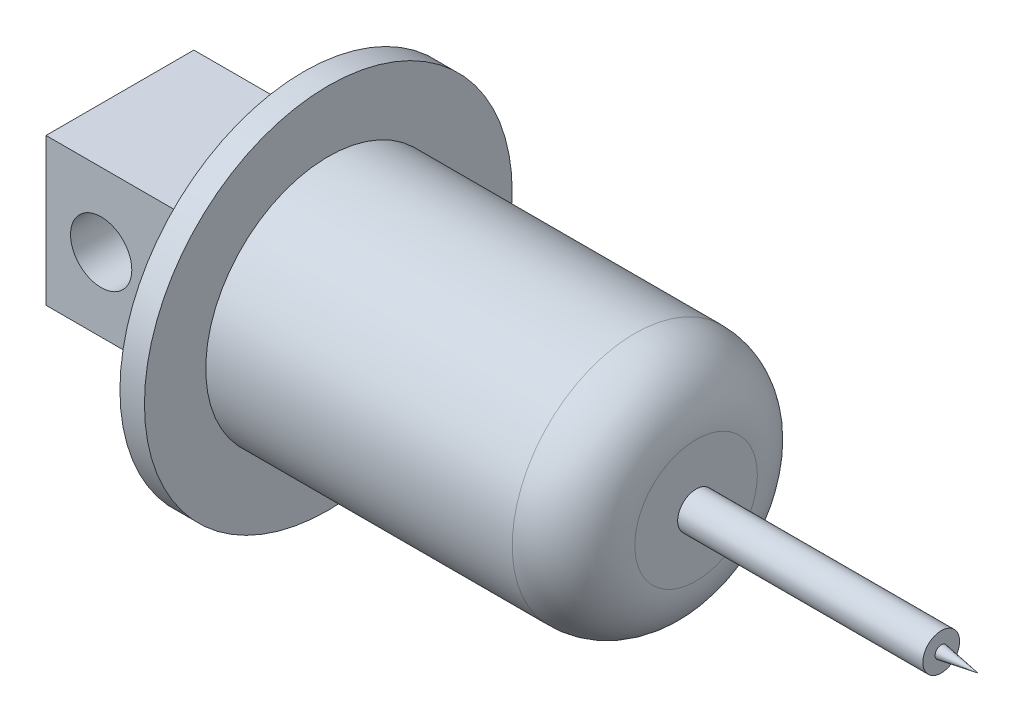
ISO-10303-21;
HEADER;
FILE_DESCRIPTION(('STEP AP214'),'2;1');
FILE_NAME('part.step','',(''),(''),'','','');
FILE_SCHEMA(('AUTOMOTIVE_DESIGN { 1 0 10303 214 1 1 1 1 }'));
ENDSEC;
DATA;
#1=APPLICATION_CONTEXT('core data for automotive mechanical design processes');
#2=APPLICATION_PROTOCOL_DEFINITION('international standard','automotive_design',2000,#1);
#3=PRODUCT_CONTEXT('',#1,'mechanical');
#4=PRODUCT('Part','Part','',(#3));
#5=PRODUCT_RELATED_PRODUCT_CATEGORY('part','',(#4));
#6=PRODUCT_DEFINITION_FORMATION('','',#4);
#7=PRODUCT_DEFINITION_CONTEXT('part definition',#1,'design');
#8=PRODUCT_DEFINITION('design','',#6,#7);
#9=PRODUCT_DEFINITION_SHAPE('','',#8);
#10=(LENGTH_UNIT() NAMED_UNIT(*) SI_UNIT(.MILLI.,.METRE.));
#11=(NAMED_UNIT(*) PLANE_ANGLE_UNIT() SI_UNIT($,.RADIAN.));
#12=(NAMED_UNIT(*) SI_UNIT($,.STERADIAN.) SOLID_ANGLE_UNIT());
#13=UNCERTAINTY_MEASURE_WITH_UNIT(LENGTH_MEASURE(1.E-05),#10,'distance_accuracy_value','');
#14=(GEOMETRIC_REPRESENTATION_CONTEXT(3) GLOBAL_UNCERTAINTY_ASSIGNED_CONTEXT((#13)) GLOBAL_UNIT_ASSIGNED_CONTEXT((#10,
#11,#12)) REPRESENTATION_CONTEXT('',''));
#15=CARTESIAN_POINT('',(0.,0.,0.));
#16=DIRECTION('',(0.,0.,1.));
#17=DIRECTION('',(1.,0.,0.));
#18=AXIS2_PLACEMENT_3D('',#15,#16,#17);
#19=CARTESIAN_POINT('',(-20.,0.,0.));
#20=DIRECTION('',(-1.,0.,0.));
#21=DIRECTION('',(0.,0.,1.));
#22=AXIS2_PLACEMENT_3D('',#19,#20,#21);
#23=CYLINDRICAL_SURFACE('',#22,10.);
#24=CARTESIAN_POINT('',(-25.,0.,0.));
#25=DIRECTION('',(1.,0.,0.));
#26=DIRECTION('',(0.,0.,-1.));
#27=AXIS2_PLACEMENT_3D('',#24,#25,#26);
#28=CIRCLE('',#27,10.);
#29=CARTESIAN_POINT('',(-25.,0.,-9.99999999999991));
#30=VERTEX_POINT('',#29);
#31=EDGE_CURVE('E11',#30,#30,#28,.F.);
#32=ORIENTED_EDGE('',*,*,#31,.T.);
#33=EDGE_LOOP('',(#32));
#34=FACE_BOUND('',#33,.T.);
#35=CARTESIAN_POINT('',(-50.,0.,1.74894432217042E-13));
#36=DIRECTION('',(1.,0.,0.));
#37=DIRECTION('',(0.,0.,-1.));
#38=AXIS2_PLACEMENT_3D('',#35,#36,#37);
#39=CIRCLE('',#38,10.);
#40=CARTESIAN_POINT('',(-50.,0.,-9.99999999999982));
#41=VERTEX_POINT('',#40);
#42=EDGE_CURVE('E167',#41,#41,#39,.T.);
#43=ORIENTED_EDGE('',*,*,#42,.T.);
#44=EDGE_LOOP('',(#43));
#45=FACE_BOUND('',#44,.T.);
#46=ADVANCED_FACE('F34',(#34,#45),#23,.T.);
#47=CARTESIAN_POINT('',(-20.,0.,0.));
#48=DIRECTION('',(1.,0.,0.));
#49=DIRECTION('',(0.,0.,-1.));
#50=AXIS2_PLACEMENT_3D('',#47,#48,#49);
#51=PLANE('',#50);
#52=CARTESIAN_POINT('',(-20.,0.,0.));
#53=DIRECTION('',(1.,0.,0.));
#54=DIRECTION('',(0.,0.,-1.));
#55=AXIS2_PLACEMENT_3D('',#52,#53,#54);
#56=CIRCLE('',#55,1.5);
#57=CARTESIAN_POINT('',(-20.,0.,-1.49999999999993));
#58=VERTEX_POINT('',#57);
#59=EDGE_CURVE('E150',#58,#58,#56,.T.);
#60=ORIENTED_EDGE('',*,*,#59,.F.);
#61=EDGE_LOOP('',(#60));
#62=FACE_BOUND('',#61,.T.);
#63=CARTESIAN_POINT('',(-20.,0.,0.));
#64=DIRECTION('',(1.,0.,0.));
#65=DIRECTION('',(0.,0.,-1.));
#66=AXIS2_PLACEMENT_3D('',#63,#64,#65);
#67=CIRCLE('',#66,5.);
#68=CARTESIAN_POINT('',(-20.,0.,-4.99999999999993));
#69=VERTEX_POINT('',#68);
#70=EDGE_CURVE('E42',#69,#69,#67,.T.);
#71=ORIENTED_EDGE('',*,*,#70,.T.);
#72=EDGE_LOOP('',(#71));
#73=FACE_BOUND('',#72,.T.);
#74=ADVANCED_FACE('F87',(#62,#73),#51,.T.);
#75=CARTESIAN_POINT('',(-52.,0.,1.81877394894729E-13));
#76=DIRECTION('',(1.,0.,0.));
#77=DIRECTION('',(0.,0.,-1.));
#78=AXIS2_PLACEMENT_3D('',#75,#76,#77);
#79=CYLINDRICAL_SURFACE('',#78,15.);
#80=CARTESIAN_POINT('',(-52.,0.,1.81877394894729E-13));
#81=DIRECTION('',(-1.,0.,0.));
#82=DIRECTION('',(0.,0.,1.));
#83=AXIS2_PLACEMENT_3D('',#80,#81,#82);
#84=CIRCLE('',#83,15.);
#85=CARTESIAN_POINT('',(-52.,0.,15.0000000000002));
#86=VERTEX_POINT('',#85);
#87=EDGE_CURVE('E164',#86,#86,#84,.T.);
#88=ORIENTED_EDGE('',*,*,#87,.F.);
#89=EDGE_LOOP('',(#88));
#90=FACE_BOUND('',#89,.T.);
#91=CARTESIAN_POINT('',(-50.,0.,1.74894432217042E-13));
#92=DIRECTION('',(-1.,0.,0.));
#93=DIRECTION('',(0.,0.,1.));
#94=AXIS2_PLACEMENT_3D('',#91,#92,#93);
#95=CIRCLE('',#94,15.);
#96=CARTESIAN_POINT('',(-50.,0.,15.0000000000002));
#97=VERTEX_POINT('',#96);
#98=EDGE_CURVE('E162',#97,#97,#95,.T.);
#99=ORIENTED_EDGE('',*,*,#98,.T.);
#100=EDGE_LOOP('',(#99));
#101=FACE_BOUND('',#100,.T.);
#102=ADVANCED_FACE('F92',(#90,#101),#79,.T.);
#103=CARTESIAN_POINT('',(-52.,0.,1.81877394894729E-13));
#104=DIRECTION('',(-1.,0.,0.));
#105=DIRECTION('',(0.,0.,1.));
#106=AXIS2_PLACEMENT_3D('',#103,#104,#105);
#107=PLANE('',#106);
#108=DIRECTION('',(0.,-1.,0.));
#109=VECTOR('',#108,1.);
#110=CARTESIAN_POINT('',(-52.,-6.,-6.03128939533191));
#111=LINE('',#110,#109);
#112=CARTESIAN_POINT('',(-52.,6.,-6.03128939533191));
#113=VERTEX_POINT('',#112);
#114=CARTESIAN_POINT('',(-52.,-6.,-6.03128939533191));
#115=VERTEX_POINT('',#114);
#116=EDGE_CURVE('E49',#113,#115,#111,.T.);
#117=ORIENTED_EDGE('',*,*,#116,.F.);
#118=DIRECTION('',(0.,0.,-1.));
#119=VECTOR('',#118,1.);
#120=CARTESIAN_POINT('',(-52.,6.,6.03128939533228));
#121=LINE('',#120,#119);
#122=CARTESIAN_POINT('',(-52.,6.,6.03128939533228));
#123=VERTEX_POINT('',#122);
#124=EDGE_CURVE('E53',#123,#113,#121,.T.);
#125=ORIENTED_EDGE('',*,*,#124,.F.);
#126=DIRECTION('',(0.,1.,0.));
#127=VECTOR('',#126,1.);
#128=CARTESIAN_POINT('',(-52.,-6.,6.03128939533228));
#129=LINE('',#128,#127);
#130=CARTESIAN_POINT('',(-52.,-6.,6.03128939533228));
#131=VERTEX_POINT('',#130);
#132=EDGE_CURVE('E277',#131,#123,#129,.T.);
#133=ORIENTED_EDGE('',*,*,#132,.F.);
#134=DIRECTION('',(0.,0.,1.));
#135=VECTOR('',#134,1.);
#136=CARTESIAN_POINT('',(-52.,-6.,6.03128939533228));
#137=LINE('',#136,#135);
#138=EDGE_CURVE('E279',#115,#131,#137,.T.);
#139=ORIENTED_EDGE('',*,*,#138,.F.);
#140=EDGE_LOOP('',(#117,#125,#133,#139));
#141=FACE_BOUND('',#140,.T.);
#142=ORIENTED_EDGE('',*,*,#87,.T.);
#143=EDGE_LOOP('',(#142));
#144=FACE_BOUND('',#143,.T.);
#145=ADVANCED_FACE('F99',(#141,#144),#107,.T.);
#146=CARTESIAN_POINT('',(-50.,0.,1.74894432217042E-13));
#147=DIRECTION('',(-1.,0.,0.));
#148=DIRECTION('',(0.,0.,1.));
#149=AXIS2_PLACEMENT_3D('',#146,#147,#148);
#150=PLANE('',#149);
#151=ORIENTED_EDGE('',*,*,#42,.F.);
#152=EDGE_LOOP('',(#151));
#153=FACE_BOUND('',#152,.T.);
#154=ORIENTED_EDGE('',*,*,#98,.F.);
#155=EDGE_LOOP('',(#154));
#156=FACE_BOUND('',#155,.T.);
#157=ADVANCED_FACE('F101',(#153,#156),#150,.F.);
#158=CARTESIAN_POINT('',(-25.,0.,0.));
#159=DIRECTION('',(1.,0.,0.));
#160=DIRECTION('',(0.,0.,-1.));
#161=AXIS2_PLACEMENT_3D('',#158,#159,#160);
#162=DEGENERATE_TOROIDAL_SURFACE('',#161,5.,5.,.T.);
#163=ORIENTED_EDGE('',*,*,#31,.F.);
#164=EDGE_LOOP('',(#163));
#165=FACE_BOUND('',#164,.T.);
#166=ORIENTED_EDGE('',*,*,#70,.F.);
#167=EDGE_LOOP('',(#166));
#168=FACE_BOUND('',#167,.T.);
#169=ADVANCED_FACE('F36',(#165,#168),#162,.T.);
#170=CARTESIAN_POINT('',(0.,0.,0.));
#171=DIRECTION('',(-1.,0.,0.));
#172=DIRECTION('',(0.,0.,1.));
#173=AXIS2_PLACEMENT_3D('',#170,#171,#172);
#174=CYLINDRICAL_SURFACE('',#173,1.5);
#175=CARTESIAN_POINT('',(0.,0.,0.));
#176=DIRECTION('',(1.,0.,0.));
#177=DIRECTION('',(0.,0.,-1.));
#178=AXIS2_PLACEMENT_3D('',#175,#176,#177);
#179=CIRCLE('',#178,1.5);
#180=CARTESIAN_POINT('',(0.,0.,-1.5));
#181=VERTEX_POINT('',#180);
#182=EDGE_CURVE('E154',#181,#181,#179,.T.);
#183=ORIENTED_EDGE('',*,*,#182,.F.);
#184=EDGE_LOOP('',(#183));
#185=FACE_BOUND('',#184,.T.);
#186=ORIENTED_EDGE('',*,*,#59,.T.);
#187=EDGE_LOOP('',(#186));
#188=FACE_BOUND('',#187,.T.);
#189=ADVANCED_FACE('F107',(#185,#188),#174,.T.);
#190=CARTESIAN_POINT('',(0.,0.,0.));
#191=DIRECTION('',(1.,0.,0.));
#192=DIRECTION('',(0.,0.,-1.));
#193=AXIS2_PLACEMENT_3D('',#190,#191,#192);
#194=PLANE('',#193);
#195=CARTESIAN_POINT('',(0.,0.,0.));
#196=DIRECTION('',(-1.,0.,0.));
#197=DIRECTION('',(0.,0.,1.));
#198=AXIS2_PLACEMENT_3D('',#195,#196,#197);
#199=CIRCLE('',#198,0.5);
#200=CARTESIAN_POINT('',(0.,0.,0.5));
#201=VERTEX_POINT('',#200);
#202=EDGE_CURVE('E292',#201,#201,#199,.T.);
#203=ORIENTED_EDGE('',*,*,#202,.T.);
#204=EDGE_LOOP('',(#203));
#205=FACE_BOUND('',#204,.T.);
#206=ORIENTED_EDGE('',*,*,#182,.T.);
#207=EDGE_LOOP('',(#206));
#208=FACE_BOUND('',#207,.T.);
#209=ADVANCED_FACE('F110',(#205,#208),#194,.T.);
#210=CARTESIAN_POINT('',(-67.,-6.,-6.03128939533186));
#211=DIRECTION('',(0.,0.,1.));
#212=DIRECTION('',(1.,0.,0.));
#213=AXIS2_PLACEMENT_3D('',#210,#211,#212);
#214=PLANE('',#213);
#215=CARTESIAN_POINT('',(-62.5,0.,-6.03128939533188));
#216=DIRECTION('',(0.,0.,1.));
#217=DIRECTION('',(1.,0.,0.));
#218=AXIS2_PLACEMENT_3D('',#215,#216,#217);
#219=CIRCLE('',#218,2.5);
#220=CARTESIAN_POINT('',(-60.,0.,-6.03128939533189));
#221=VERTEX_POINT('',#220);
#222=EDGE_CURVE('E282',#221,#221,#219,.T.);
#223=ORIENTED_EDGE('',*,*,#222,.T.);
#224=EDGE_LOOP('',(#223));
#225=FACE_BOUND('',#224,.T.);
#226=ORIENTED_EDGE('',*,*,#116,.T.);
#227=DIRECTION('',(1.,0.,0.));
#228=VECTOR('',#227,1.);
#229=CARTESIAN_POINT('',(-67.,-6.,-6.03128939533186));
#230=LINE('',#229,#228);
#231=CARTESIAN_POINT('',(-67.,-6.,-6.03128939533186));
#232=VERTEX_POINT('',#231);
#233=EDGE_CURVE('E148',#232,#115,#230,.T.);
#234=ORIENTED_EDGE('',*,*,#233,.F.);
#235=DIRECTION('',(0.,-1.,0.));
#236=VECTOR('',#235,1.);
#237=CARTESIAN_POINT('',(-67.,-6.,-6.03128939533186));
#238=LINE('',#237,#236);
#239=CARTESIAN_POINT('',(-67.,6.,-6.03128939533186));
#240=VERTEX_POINT('',#239);
#241=EDGE_CURVE('E137',#240,#232,#238,.T.);
#242=ORIENTED_EDGE('',*,*,#241,.F.);
#243=DIRECTION('',(1.,0.,0.));
#244=VECTOR('',#243,1.);
#245=CARTESIAN_POINT('',(-67.,6.,-6.03128939533186));
#246=LINE('',#245,#244);
#247=EDGE_CURVE('E274',#240,#113,#246,.T.);
#248=ORIENTED_EDGE('',*,*,#247,.T.);
#249=EDGE_LOOP('',(#226,#234,#242,#248));
#250=FACE_BOUND('',#249,.T.);
#251=ADVANCED_FACE('F114',(#225,#250),#214,.F.);
#252=CARTESIAN_POINT('',(-67.,-6.,6.03128939533233));
#253=DIRECTION('',(0.,1.,0.));
#254=DIRECTION('',(0.,0.,1.));
#255=AXIS2_PLACEMENT_3D('',#252,#253,#254);
#256=PLANE('',#255);
#257=ORIENTED_EDGE('',*,*,#138,.T.);
#258=DIRECTION('',(1.,0.,0.));
#259=VECTOR('',#258,1.);
#260=CARTESIAN_POINT('',(-67.,-6.,6.03128939533233));
#261=LINE('',#260,#259);
#262=CARTESIAN_POINT('',(-67.,-6.,6.03128939533233));
#263=VERTEX_POINT('',#262);
#264=EDGE_CURVE('E151',#263,#131,#261,.T.);
#265=ORIENTED_EDGE('',*,*,#264,.F.);
#266=DIRECTION('',(0.,0.,1.));
#267=VECTOR('',#266,1.);
#268=CARTESIAN_POINT('',(-67.,-6.,6.03128939533233));
#269=LINE('',#268,#267);
#270=EDGE_CURVE('E139',#232,#263,#269,.T.);
#271=ORIENTED_EDGE('',*,*,#270,.F.);
#272=ORIENTED_EDGE('',*,*,#233,.T.);
#273=EDGE_LOOP('',(#257,#265,#271,#272));
#274=FACE_BOUND('',#273,.T.);
#275=ADVANCED_FACE('F118',(#274),#256,.F.);
#276=CARTESIAN_POINT('',(-67.,-6.,6.03128939533233));
#277=DIRECTION('',(0.,0.,-1.));
#278=DIRECTION('',(-1.,0.,0.));
#279=AXIS2_PLACEMENT_3D('',#276,#277,#278);
#280=PLANE('',#279);
#281=CARTESIAN_POINT('',(-62.5,0.,6.03128939533231));
#282=DIRECTION('',(0.,0.,1.));
#283=DIRECTION('',(1.,0.,0.));
#284=AXIS2_PLACEMENT_3D('',#281,#282,#283);
#285=CIRCLE('',#284,2.5);
#286=CARTESIAN_POINT('',(-60.,0.,6.0312893953323));
#287=VERTEX_POINT('',#286);
#288=EDGE_CURVE('E289',#287,#287,#285,.T.);
#289=ORIENTED_EDGE('',*,*,#288,.F.);
#290=EDGE_LOOP('',(#289));
#291=FACE_BOUND('',#290,.T.);
#292=ORIENTED_EDGE('',*,*,#132,.T.);
#293=DIRECTION('',(1.,0.,0.));
#294=VECTOR('',#293,1.);
#295=CARTESIAN_POINT('',(-67.,6.,6.03128939533233));
#296=LINE('',#295,#294);
#297=CARTESIAN_POINT('',(-67.,6.,6.03128939533233));
#298=VERTEX_POINT('',#297);
#299=EDGE_CURVE('E157',#298,#123,#296,.T.);
#300=ORIENTED_EDGE('',*,*,#299,.F.);
#301=DIRECTION('',(0.,1.,0.));
#302=VECTOR('',#301,1.);
#303=CARTESIAN_POINT('',(-67.,-6.,6.03128939533233));
#304=LINE('',#303,#302);
#305=EDGE_CURVE('E284',#263,#298,#304,.T.);
#306=ORIENTED_EDGE('',*,*,#305,.F.);
#307=ORIENTED_EDGE('',*,*,#264,.T.);
#308=EDGE_LOOP('',(#292,#300,#306,#307));
#309=FACE_BOUND('',#308,.T.);
#310=ADVANCED_FACE('F122',(#291,#309),#280,.F.);
#311=CARTESIAN_POINT('',(-67.,6.,6.03128939533233));
#312=DIRECTION('',(0.,-1.,0.));
#313=DIRECTION('',(0.,0.,-1.));
#314=AXIS2_PLACEMENT_3D('',#311,#312,#313);
#315=PLANE('',#314);
#316=ORIENTED_EDGE('',*,*,#124,.T.);
#317=ORIENTED_EDGE('',*,*,#247,.F.);
#318=DIRECTION('',(0.,0.,-1.));
#319=VECTOR('',#318,1.);
#320=CARTESIAN_POINT('',(-67.,6.,6.03128939533233));
#321=LINE('',#320,#319);
#322=EDGE_CURVE('E142',#298,#240,#321,.T.);
#323=ORIENTED_EDGE('',*,*,#322,.F.);
#324=ORIENTED_EDGE('',*,*,#299,.T.);
#325=EDGE_LOOP('',(#316,#317,#323,#324));
#326=FACE_BOUND('',#325,.T.);
#327=ADVANCED_FACE('F126',(#326),#315,.F.);
#328=CARTESIAN_POINT('',(-67.,0.,2.34249614977376E-13));
#329=DIRECTION('',(-1.,0.,0.));
#330=DIRECTION('',(0.,0.,1.));
#331=AXIS2_PLACEMENT_3D('',#328,#329,#330);
#332=PLANE('',#331);
#333=ORIENTED_EDGE('',*,*,#241,.T.);
#334=ORIENTED_EDGE('',*,*,#270,.T.);
#335=ORIENTED_EDGE('',*,*,#305,.T.);
#336=ORIENTED_EDGE('',*,*,#322,.T.);
#337=EDGE_LOOP('',(#333,#334,#335,#336));
#338=FACE_BOUND('',#337,.T.);
#339=ADVANCED_FACE('F82',(#338),#332,.T.);
#340=CARTESIAN_POINT('',(-62.5000000000001,0.,-14.9999999999998));
#341=DIRECTION('',(0.,0.,1.));
#342=DIRECTION('',(1.,0.,0.));
#343=AXIS2_PLACEMENT_3D('',#340,#341,#342);
#344=CYLINDRICAL_SURFACE('',#343,2.5);
#345=CARTESIAN_POINT('',(-60.,0.,6.0312893953323));
#346=CARTESIAN_POINT('',(-60.,0.,5.90563753292955));
#347=CARTESIAN_POINT('',(-60.,0.,5.7799856705268));
#348=CARTESIAN_POINT('',(-60.,0.,5.52868194572129));
#349=CARTESIAN_POINT('',(-60.,0.,5.40303008331854));
#350=CARTESIAN_POINT('',(-60.,0.,5.15172635851304));
#351=CARTESIAN_POINT('',(-60.,0.,5.02607449611029));
#352=CARTESIAN_POINT('',(-60.,0.,4.77477077130478));
#353=CARTESIAN_POINT('',(-60.,0.,4.64911890890203));
#354=CARTESIAN_POINT('',(-60.,0.,4.39781518409653));
#355=CARTESIAN_POINT('',(-60.,0.,4.27216332169377));
#356=CARTESIAN_POINT('',(-60.,0.,4.02085959688827));
#357=CARTESIAN_POINT('',(-60.,0.,3.89520773448552));
#358=CARTESIAN_POINT('',(-60.,0.,3.64390400968001));
#359=CARTESIAN_POINT('',(-60.,0.,3.51825214727726));
#360=CARTESIAN_POINT('',(-60.,0.,3.26694842247176));
#361=CARTESIAN_POINT('',(-60.,0.,3.14129656006901));
#362=CARTESIAN_POINT('',(-60.,0.,2.8899928352635));
#363=CARTESIAN_POINT('',(-60.,0.,2.76434097286075));
#364=CARTESIAN_POINT('',(-60.,0.,2.51303724805525));
#365=CARTESIAN_POINT('',(-60.,0.,2.38738538565249));
#366=CARTESIAN_POINT('',(-60.,0.,2.13608166084699));
#367=CARTESIAN_POINT('',(-60.,0.,2.01042979844424));
#368=CARTESIAN_POINT('',(-60.,0.,1.75912607363873));
#369=CARTESIAN_POINT('',(-60.,0.,1.63347421123598));
#370=CARTESIAN_POINT('',(-60.,0.,1.38217048643048));
#371=CARTESIAN_POINT('',(-60.,0.,1.25651862402773));
#372=CARTESIAN_POINT('',(-60.,0.,1.00521489922222));
#373=CARTESIAN_POINT('',(-60.,0.,0.87956303681947));
#374=CARTESIAN_POINT('',(-60.,0.,0.628259312013967));
#375=CARTESIAN_POINT('',(-60.,0.,0.502607449611216));
#376=CARTESIAN_POINT('',(-60.,0.,0.251303724805712));
#377=CARTESIAN_POINT('',(-60.,0.,0.12565186240296));
#378=CARTESIAN_POINT('',(-60.,0.,-0.125651862402544));
#379=CARTESIAN_POINT('',(-60.,0.,-0.251303724805296));
#380=CARTESIAN_POINT('',(-60.,0.,-0.5026074496108));
#381=CARTESIAN_POINT('',(-60.,0.,-0.628259312013552));
#382=CARTESIAN_POINT('',(-60.,0.,-0.879563036819056));
#383=CARTESIAN_POINT('',(-60.,0.,-1.00521489922181));
#384=CARTESIAN_POINT('',(-60.,0.,-1.25651862402731));
#385=CARTESIAN_POINT('',(-60.,0.,-1.38217048643006));
#386=CARTESIAN_POINT('',(-60.,0.,-1.63347421123557));
#387=CARTESIAN_POINT('',(-60.,0.,-1.75912607363832));
#388=CARTESIAN_POINT('',(-60.,0.,-2.01042979844382));
#389=CARTESIAN_POINT('',(-60.,0.,-2.13608166084658));
#390=CARTESIAN_POINT('',(-60.,0.,-2.38738538565208));
#391=CARTESIAN_POINT('',(-60.,0.,-2.51303724805483));
#392=CARTESIAN_POINT('',(-60.,0.,-2.76434097286034));
#393=CARTESIAN_POINT('',(-60.,0.,-2.88999283526309));
#394=CARTESIAN_POINT('',(-60.,0.,-3.14129656006859));
#395=CARTESIAN_POINT('',(-60.,0.,-3.26694842247134));
#396=CARTESIAN_POINT('',(-60.,0.,-3.51825214727685));
#397=CARTESIAN_POINT('',(-60.,0.,-3.6439040096796));
#398=CARTESIAN_POINT('',(-60.,0.,-3.8952077344851));
#399=CARTESIAN_POINT('',(-60.,0.,-4.02085959688786));
#400=CARTESIAN_POINT('',(-60.,0.,-4.27216332169336));
#401=CARTESIAN_POINT('',(-60.,0.,-4.39781518409611));
#402=CARTESIAN_POINT('',(-60.,0.,-4.64911890890161));
#403=CARTESIAN_POINT('',(-60.,0.,-4.77477077130437));
#404=CARTESIAN_POINT('',(-60.,0.,-5.02607449610987));
#405=CARTESIAN_POINT('',(-60.,0.,-5.15172635851262));
#406=CARTESIAN_POINT('',(-60.,0.,-5.40303008331813));
#407=CARTESIAN_POINT('',(-60.,0.,-5.52868194572088));
#408=CARTESIAN_POINT('',(-60.,0.,-5.77998567052638));
#409=CARTESIAN_POINT('',(-60.,0.,-5.90563753292914));
#410=CARTESIAN_POINT('',(-60.,0.,-6.03128939533189));
#411=B_SPLINE_CURVE_WITH_KNOTS('',3,(#345,#346,#347,#348,#349,#350,#351,#352,#353,#354,#355,
#356,#357,#358,#359,#360,#361,#362,#363,#364,#365,#366,#367,#368,#369,#370,#371,#372,#373,#374,
#375,#376,#377,#378,#379,#380,#381,#382,#383,#384,#385,#386,#387,#388,#389,#390,#391,#392,#393,
#394,#395,#396,#397,#398,#399,#400,#401,#402,#403,#404,#405,#406,#407,#408,#409,#410),
.UNSPECIFIED.,.F.,.F.,(4,2,2,2,2,2,2,2,2,2,2,2,2,2,2,2,2,2,2,2,2,2,2,2,2,2,2,2,2,2,2,2,4),(0.,
0.376955587208256,0.753911174416512,1.13086676162477,1.50782234883302,1.88477793604128,
2.26173352324954,2.63868911045779,3.01564469766605,3.3926002848743,3.76955587208256,
4.14651145929082,4.52346704649907,4.90042263370733,5.27737822091558,5.65433380812384,
6.03128939533209,6.40824498254035,6.78520056974861,7.16215615695686,7.53911174416512,
7.91606733137337,8.29302291858163,8.66997850578989,9.04693409299814,9.4238896802064,
9.80084526741465,10.1778008546229,10.5547564418312,10.9317120290394,11.3086676162477,
11.6856232034559,12.0625787906642),.UNSPECIFIED.);
#412=EDGE_CURVE('BSEAM76',#287,#221,#411,.T.);
#413=ORIENTED_EDGE('',*,*,#288,.T.);
#414=ORIENTED_EDGE('',*,*,#222,.F.);
#415=ORIENTED_EDGE('',*,*,#412,.T.);
#416=ORIENTED_EDGE('',*,*,#412,.F.);
#417=EDGE_LOOP('',(#413,#415,#414,#416));
#418=FACE_BOUND('',#417,.T.);
#419=ADVANCED_FACE('F76',(#418),#344,.F.);
#420=CARTESIAN_POINT('',(3.,0.,0.));
#421=DIRECTION('',(-1.,0.,0.));
#422=DIRECTION('',(0.,0.,1.));
#423=AXIS2_PLACEMENT_3D('',#420,#421,#422);
#424=CONICAL_SURFACE('',#423,0.,0.165148677414627);
#425=ORIENTED_EDGE('',*,*,#202,.F.);
#426=EDGE_LOOP('',(#425));
#427=FACE_BOUND('',#426,.T.);
#428=CARTESIAN_POINT('',(3.,0.,0.));
#429=VERTEX_POINT('',#428);
#430=VERTEX_LOOP('',#429);
#431=FACE_BOUND('',#430,.T.);
#432=ADVANCED_FACE('F74',(#427,#431),#424,.T.);
#433=CLOSED_SHELL('',(#46,#74,#102,#145,#157,#169,#189,#209,#251,#275,#310,#327,#339,#419,#432));
#434=MANIFOLD_SOLID_BREP('B2',#433);
#435=ADVANCED_BREP_SHAPE_REPRESENTATION('',(#18,#434),#14);
#436=SHAPE_DEFINITION_REPRESENTATION(#9,#435);
ENDSEC;
END-ISO-10303-21;
